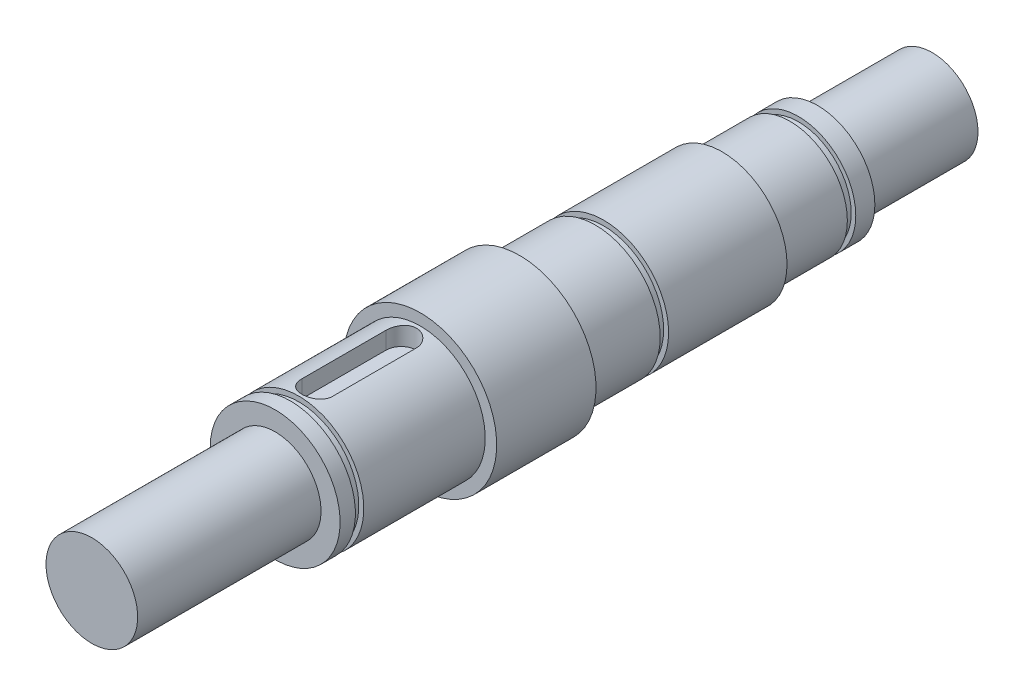
ISO-10303-21;
HEADER;
FILE_DESCRIPTION(('STEP AP214'),'2;1');
FILE_NAME('part.step','',(''),(''),'','','');
FILE_SCHEMA(('AUTOMOTIVE_DESIGN { 1 0 10303 214 1 1 1 1 }'));
ENDSEC;
DATA;
#1=APPLICATION_CONTEXT('core data for automotive mechanical design processes');
#2=APPLICATION_PROTOCOL_DEFINITION('international standard','automotive_design',2000,#1);
#3=PRODUCT_CONTEXT('',#1,'mechanical');
#4=PRODUCT('Part','Part','',(#3));
#5=PRODUCT_RELATED_PRODUCT_CATEGORY('part','',(#4));
#6=PRODUCT_DEFINITION_FORMATION('','',#4);
#7=PRODUCT_DEFINITION_CONTEXT('part definition',#1,'design');
#8=PRODUCT_DEFINITION('design','',#6,#7);
#9=PRODUCT_DEFINITION_SHAPE('','',#8);
#10=(LENGTH_UNIT() NAMED_UNIT(*) SI_UNIT(.MILLI.,.METRE.));
#11=(NAMED_UNIT(*) PLANE_ANGLE_UNIT() SI_UNIT($,.RADIAN.));
#12=(NAMED_UNIT(*) SI_UNIT($,.STERADIAN.) SOLID_ANGLE_UNIT());
#13=UNCERTAINTY_MEASURE_WITH_UNIT(LENGTH_MEASURE(1.E-05),#10,'distance_accuracy_value','');
#14=(GEOMETRIC_REPRESENTATION_CONTEXT(3) GLOBAL_UNCERTAINTY_ASSIGNED_CONTEXT((#13)) GLOBAL_UNIT_ASSIGNED_CONTEXT((#10,
#11,#12)) REPRESENTATION_CONTEXT('',''));
#15=CARTESIAN_POINT('',(0.,0.,0.));
#16=DIRECTION('',(0.,0.,1.));
#17=DIRECTION('',(1.,0.,0.));
#18=AXIS2_PLACEMENT_3D('',#15,#16,#17);
#19=CARTESIAN_POINT('',(0.,0.,0.));
#20=DIRECTION('',(0.,0.,1.));
#21=DIRECTION('',(1.,0.,0.));
#22=AXIS2_PLACEMENT_3D('',#19,#20,#21);
#23=CYLINDRICAL_SURFACE('',#22,8.5);
#24=CARTESIAN_POINT('',(0.,0.,-21.5));
#25=DIRECTION('',(0.,0.,1.));
#26=DIRECTION('',(1.,0.,0.));
#27=AXIS2_PLACEMENT_3D('',#24,#25,#26);
#28=CIRCLE('',#27,8.5);
#29=CARTESIAN_POINT('',(8.5,0.,-21.5));
#30=VERTEX_POINT('',#29);
#31=EDGE_CURVE('E148',#30,#30,#28,.T.);
#32=ORIENTED_EDGE('',*,*,#31,.T.);
#33=EDGE_LOOP('',(#32));
#34=FACE_BOUND('',#33,.T.);
#35=CARTESIAN_POINT('',(0.,0.,-5.99999999999999));
#36=DIRECTION('',(0.,0.,1.));
#37=DIRECTION('',(1.,0.,0.));
#38=AXIS2_PLACEMENT_3D('',#35,#36,#37);
#39=CIRCLE('',#38,8.5);
#40=CARTESIAN_POINT('',(8.5,0.,-5.99999999999999));
#41=VERTEX_POINT('',#40);
#42=EDGE_CURVE('E115',#41,#41,#39,.T.);
#43=ORIENTED_EDGE('',*,*,#42,.F.);
#44=EDGE_LOOP('',(#43));
#45=FACE_BOUND('',#44,.T.);
#46=ADVANCED_FACE('F34',(#34,#45),#23,.T.);
#47=CARTESIAN_POINT('',(0.,0.,0.));
#48=DIRECTION('',(0.,0.,1.));
#49=DIRECTION('',(1.,0.,0.));
#50=AXIS2_PLACEMENT_3D('',#47,#48,#49);
#51=CYLINDRICAL_SURFACE('',#50,7.5);
#52=CARTESIAN_POINT('',(0.,0.,-21.5));
#53=DIRECTION('',(0.,0.,1.));
#54=DIRECTION('',(1.,0.,0.));
#55=AXIS2_PLACEMENT_3D('',#52,#53,#54);
#56=CIRCLE('',#55,7.5);
#57=CARTESIAN_POINT('',(7.5,0.,-21.5));
#58=VERTEX_POINT('',#57);
#59=EDGE_CURVE('E145',#58,#58,#56,.T.);
#60=ORIENTED_EDGE('',*,*,#59,.F.);
#61=EDGE_LOOP('',(#60));
#62=FACE_BOUND('',#61,.T.);
#63=CARTESIAN_POINT('',(0.,0.,-30.4));
#64=DIRECTION('',(0.,0.,1.));
#65=DIRECTION('',(1.,0.,0.));
#66=AXIS2_PLACEMENT_3D('',#63,#64,#65);
#67=CIRCLE('',#66,7.5);
#68=CARTESIAN_POINT('',(7.5,0.,-30.4));
#69=VERTEX_POINT('',#68);
#70=EDGE_CURVE('E136',#69,#69,#67,.T.);
#71=ORIENTED_EDGE('',*,*,#70,.T.);
#72=EDGE_LOOP('',(#71));
#73=FACE_BOUND('',#72,.T.);
#74=ADVANCED_FACE('F256',(#62,#73),#51,.T.);
#75=CARTESIAN_POINT('',(0.,8.5,-21.5));
#76=DIRECTION('',(0.,0.,-1.));
#77=DIRECTION('',(-1.,0.,0.));
#78=AXIS2_PLACEMENT_3D('',#75,#76,#77);
#79=PLANE('',#78);
#80=ORIENTED_EDGE('',*,*,#59,.T.);
#81=EDGE_LOOP('',(#80));
#82=FACE_BOUND('',#81,.T.);
#83=ORIENTED_EDGE('',*,*,#31,.F.);
#84=EDGE_LOOP('',(#83));
#85=FACE_BOUND('',#84,.T.);
#86=ADVANCED_FACE('F247',(#82,#85),#79,.T.);
#87=CARTESIAN_POINT('',(0.,7.5,-30.4));
#88=DIRECTION('',(0.,0.,-1.));
#89=DIRECTION('',(-1.,0.,0.));
#90=AXIS2_PLACEMENT_3D('',#87,#88,#89);
#91=PLANE('',#90);
#92=CARTESIAN_POINT('',(0.,0.,-30.4));
#93=DIRECTION('',(0.,0.,1.));
#94=DIRECTION('',(1.,0.,0.));
#95=AXIS2_PLACEMENT_3D('',#92,#93,#94);
#96=CIRCLE('',#95,6.9);
#97=CARTESIAN_POINT('',(6.9,0.,-30.4));
#98=VERTEX_POINT('',#97);
#99=EDGE_CURVE('E133',#98,#98,#96,.T.);
#100=ORIENTED_EDGE('',*,*,#99,.T.);
#101=EDGE_LOOP('',(#100));
#102=FACE_BOUND('',#101,.T.);
#103=ORIENTED_EDGE('',*,*,#70,.F.);
#104=EDGE_LOOP('',(#103));
#105=FACE_BOUND('',#104,.T.);
#106=ADVANCED_FACE('F243',(#102,#105),#91,.T.);
#107=CARTESIAN_POINT('',(0.,0.,0.));
#108=DIRECTION('',(0.,0.,1.));
#109=DIRECTION('',(1.,0.,0.));
#110=AXIS2_PLACEMENT_3D('',#107,#108,#109);
#111=CYLINDRICAL_SURFACE('',#110,6.9);
#112=CARTESIAN_POINT('',(0.,0.,-31.5));
#113=DIRECTION('',(0.,0.,1.));
#114=DIRECTION('',(1.,0.,0.));
#115=AXIS2_PLACEMENT_3D('',#112,#113,#114);
#116=CIRCLE('',#115,6.9);
#117=CARTESIAN_POINT('',(6.9,0.,-31.5));
#118=VERTEX_POINT('',#117);
#119=EDGE_CURVE('E130',#118,#118,#116,.T.);
#120=ORIENTED_EDGE('',*,*,#119,.T.);
#121=EDGE_LOOP('',(#120));
#122=FACE_BOUND('',#121,.T.);
#123=ORIENTED_EDGE('',*,*,#99,.F.);
#124=EDGE_LOOP('',(#123));
#125=FACE_BOUND('',#124,.T.);
#126=ADVANCED_FACE('F239',(#122,#125),#111,.T.);
#127=CARTESIAN_POINT('',(0.,6.9,-31.5));
#128=DIRECTION('',(0.,0.,1.));
#129=DIRECTION('',(1.,0.,0.));
#130=AXIS2_PLACEMENT_3D('',#127,#128,#129);
#131=PLANE('',#130);
#132=CARTESIAN_POINT('',(0.,0.,-31.5));
#133=DIRECTION('',(0.,0.,1.));
#134=DIRECTION('',(1.,0.,0.));
#135=AXIS2_PLACEMENT_3D('',#132,#133,#134);
#136=CIRCLE('',#135,7.5);
#137=CARTESIAN_POINT('',(7.5,0.,-31.5));
#138=VERTEX_POINT('',#137);
#139=EDGE_CURVE('E127',#138,#138,#136,.T.);
#140=ORIENTED_EDGE('',*,*,#139,.T.);
#141=EDGE_LOOP('',(#140));
#142=FACE_BOUND('',#141,.T.);
#143=ORIENTED_EDGE('',*,*,#119,.F.);
#144=EDGE_LOOP('',(#143));
#145=FACE_BOUND('',#144,.T.);
#146=ADVANCED_FACE('F235',(#142,#145),#131,.T.);
#147=CARTESIAN_POINT('',(0.,0.,0.));
#148=DIRECTION('',(0.,0.,1.));
#149=DIRECTION('',(1.,0.,0.));
#150=AXIS2_PLACEMENT_3D('',#147,#148,#149);
#151=CYLINDRICAL_SURFACE('',#150,6.);
#152=CARTESIAN_POINT('',(0.,0.,-49.));
#153=DIRECTION('',(0.,0.,1.));
#154=DIRECTION('',(1.,0.,0.));
#155=AXIS2_PLACEMENT_3D('',#152,#153,#154);
#156=CIRCLE('',#155,6.);
#157=CARTESIAN_POINT('',(6.,0.,-49.));
#158=VERTEX_POINT('',#157);
#159=EDGE_CURVE('E172',#158,#158,#156,.F.);
#160=ORIENTED_EDGE('',*,*,#159,.F.);
#161=EDGE_LOOP('',(#160));
#162=FACE_BOUND('',#161,.T.);
#163=CARTESIAN_POINT('',(0.,0.,-34.));
#164=DIRECTION('',(0.,0.,1.));
#165=DIRECTION('',(1.,0.,0.));
#166=AXIS2_PLACEMENT_3D('',#163,#164,#165);
#167=CIRCLE('',#166,6.);
#168=CARTESIAN_POINT('',(6.,0.,-34.));
#169=VERTEX_POINT('',#168);
#170=EDGE_CURVE('E139',#169,#169,#167,.T.);
#171=ORIENTED_EDGE('',*,*,#170,.F.);
#172=EDGE_LOOP('',(#171));
#173=FACE_BOUND('',#172,.T.);
#174=ADVANCED_FACE('F238',(#162,#173),#151,.T.);
#175=CARTESIAN_POINT('',(0.,7.5,-34.));
#176=DIRECTION('',(0.,0.,-1.));
#177=DIRECTION('',(-1.,0.,0.));
#178=AXIS2_PLACEMENT_3D('',#175,#176,#177);
#179=PLANE('',#178);
#180=ORIENTED_EDGE('',*,*,#170,.T.);
#181=EDGE_LOOP('',(#180));
#182=FACE_BOUND('',#181,.T.);
#183=CARTESIAN_POINT('',(0.,0.,-34.));
#184=DIRECTION('',(0.,0.,1.));
#185=DIRECTION('',(1.,0.,0.));
#186=AXIS2_PLACEMENT_3D('',#183,#184,#185);
#187=CIRCLE('',#186,7.5);
#188=CARTESIAN_POINT('',(7.5,0.,-34.));
#189=VERTEX_POINT('',#188);
#190=EDGE_CURVE('E142',#189,#189,#187,.T.);
#191=ORIENTED_EDGE('',*,*,#190,.F.);
#192=EDGE_LOOP('',(#191));
#193=FACE_BOUND('',#192,.T.);
#194=ADVANCED_FACE('F251',(#182,#193),#179,.T.);
#195=ORIENTED_EDGE('',*,*,#190,.T.);
#196=EDGE_LOOP('',(#195));
#197=FACE_BOUND('',#196,.T.);
#198=ORIENTED_EDGE('',*,*,#139,.F.);
#199=EDGE_LOOP('',(#198));
#200=FACE_BOUND('',#199,.T.);
#201=ADVANCED_FACE('F233',(#197,#200),#51,.T.);
#202=CARTESIAN_POINT('',(0.,8.5,-4.9));
#203=DIRECTION('',(0.,0.,-1.));
#204=DIRECTION('',(-1.,0.,0.));
#205=AXIS2_PLACEMENT_3D('',#202,#203,#204);
#206=PLANE('',#205);
#207=CARTESIAN_POINT('',(0.,0.,-4.9));
#208=DIRECTION('',(0.,0.,1.));
#209=DIRECTION('',(1.,0.,0.));
#210=AXIS2_PLACEMENT_3D('',#207,#208,#209);
#211=CIRCLE('',#210,7.85);
#212=CARTESIAN_POINT('',(7.85,0.,-4.9));
#213=VERTEX_POINT('',#212);
#214=EDGE_CURVE('E121',#213,#213,#211,.T.);
#215=ORIENTED_EDGE('',*,*,#214,.T.);
#216=EDGE_LOOP('',(#215));
#217=FACE_BOUND('',#216,.T.);
#218=CARTESIAN_POINT('',(0.,0.,-4.9));
#219=DIRECTION('',(0.,0.,1.));
#220=DIRECTION('',(1.,0.,0.));
#221=AXIS2_PLACEMENT_3D('',#218,#219,#220);
#222=CIRCLE('',#221,8.5);
#223=CARTESIAN_POINT('',(8.5,0.,-4.9));
#224=VERTEX_POINT('',#223);
#225=EDGE_CURVE('E124',#224,#224,#222,.T.);
#226=ORIENTED_EDGE('',*,*,#225,.F.);
#227=EDGE_LOOP('',(#226));
#228=FACE_BOUND('',#227,.T.);
#229=ADVANCED_FACE('F229',(#217,#228),#206,.T.);
#230=CARTESIAN_POINT('',(0.,0.,0.));
#231=DIRECTION('',(0.,0.,1.));
#232=DIRECTION('',(1.,0.,0.));
#233=AXIS2_PLACEMENT_3D('',#230,#231,#232);
#234=CYLINDRICAL_SURFACE('',#233,7.85);
#235=CARTESIAN_POINT('',(0.,0.,-5.99999999999999));
#236=DIRECTION('',(0.,0.,1.));
#237=DIRECTION('',(1.,0.,0.));
#238=AXIS2_PLACEMENT_3D('',#235,#236,#237);
#239=CIRCLE('',#238,7.85);
#240=CARTESIAN_POINT('',(7.85,0.,-5.99999999999999));
#241=VERTEX_POINT('',#240);
#242=EDGE_CURVE('E118',#241,#241,#239,.T.);
#243=ORIENTED_EDGE('',*,*,#242,.T.);
#244=EDGE_LOOP('',(#243));
#245=FACE_BOUND('',#244,.T.);
#246=ORIENTED_EDGE('',*,*,#214,.F.);
#247=EDGE_LOOP('',(#246));
#248=FACE_BOUND('',#247,.T.);
#249=ADVANCED_FACE('F225',(#245,#248),#234,.T.);
#250=CARTESIAN_POINT('',(0.,7.85,-5.99999999999999));
#251=DIRECTION('',(0.,0.,1.));
#252=DIRECTION('',(1.,0.,0.));
#253=AXIS2_PLACEMENT_3D('',#250,#251,#252);
#254=PLANE('',#253);
#255=ORIENTED_EDGE('',*,*,#42,.T.);
#256=EDGE_LOOP('',(#255));
#257=FACE_BOUND('',#256,.T.);
#258=ORIENTED_EDGE('',*,*,#242,.F.);
#259=EDGE_LOOP('',(#258));
#260=FACE_BOUND('',#259,.T.);
#261=ADVANCED_FACE('F222',(#257,#260),#254,.T.);
#262=CARTESIAN_POINT('',(0.,0.,0.));
#263=DIRECTION('',(0.,0.,-1.));
#264=DIRECTION('',(-1.,0.,0.));
#265=AXIS2_PLACEMENT_3D('',#262,#263,#264);
#266=CYLINDRICAL_SURFACE('',#265,8.49999999999999);
#267=DIRECTION('',(0.,0.,-1.));
#268=VECTOR('',#267,1.);
#269=CARTESIAN_POINT('',(2.,8.26135582092915,0.));
#270=LINE('',#269,#268);
#271=CARTESIAN_POINT('',(2.,8.26135582092915,20.5));
#272=VERTEX_POINT('',#271);
#273=CARTESIAN_POINT('',(2.,8.26135582092915,31.5));
#274=VERTEX_POINT('',#273);
#275=EDGE_CURVE('E11',#272,#274,#270,.F.);
#276=ORIENTED_EDGE('',*,*,#275,.T.);
#277=CARTESIAN_POINT('',(2.,8.26135582092915,31.5));
#278=CARTESIAN_POINT('',(2.00000055504916,8.26135236320291,31.5554344323461));
#279=CARTESIAN_POINT('',(1.99769380139236,8.2619144856103,31.6108415088054));
#280=CARTESIAN_POINT('',(1.98849731170137,8.264134056541,31.7212434339864));
#281=CARTESIAN_POINT('',(1.98160828133566,8.26579133641031,31.7762383448629));
#282=CARTESIAN_POINT('',(1.95416393612277,8.27234056234883,31.9397976249519));
#283=CARTESIAN_POINT('',(1.92683096321235,8.27881027991498,32.0472414713627));
#284=CARTESIAN_POINT('',(1.85496116677948,8.2952069846652,32.2558503459617));
#285=CARTESIAN_POINT('',(1.81042483664592,8.30513387269751,32.3570155541234));
#286=CARTESIAN_POINT('',(1.70546046419012,8.32732086336626,32.5504829517604));
#287=CARTESIAN_POINT('',(1.6450289846229,8.33958147049888,32.6427832183367));
#288=CARTESIAN_POINT('',(1.50874637759439,8.36531906602218,32.8176445304475));
#289=CARTESIAN_POINT('',(1.43264491321002,8.37881352706603,32.9000078464186));
#290=CARTESIAN_POINT('',(1.26771483694585,8.40534737590744,33.0509339049673));
#291=CARTESIAN_POINT('',(1.17888421755235,8.41838669151992,33.1194944666046));
#292=CARTESIAN_POINT('',(0.989672002747237,8.44273322723499,33.2416609494937));
#293=CARTESIAN_POINT('',(0.889162184224324,8.45401726068055,33.2950732925612));
#294=CARTESIAN_POINT('',(0.68028730939155,8.47338148505522,33.3841696035676));
#295=CARTESIAN_POINT('',(0.571923680419551,8.48146225642123,33.4198567836348));
#296=CARTESIAN_POINT('',(0.352485313548646,8.49338596556868,33.4718616310578));
#297=CARTESIAN_POINT('',(0.241494636223676,8.49730265616028,33.4885167992637));
#298=CARTESIAN_POINT('',(0.0182275662118484,8.50071323920615,33.5030423420087));
#299=CARTESIAN_POINT('',(-0.0940486848647809,8.50020761420043,33.5009147660224));
#300=CARTESIAN_POINT('',(-0.314360678706196,8.49488597842208,33.4781814254168));
#301=CARTESIAN_POINT('',(-0.422436389839878,8.490154991221,33.4579401327781));
#302=CARTESIAN_POINT('',(-0.633611361576776,8.47701221926344,33.4001375163765));
#303=CARTESIAN_POINT('',(-0.736710417304356,8.46860028311536,33.3625754802352));
#304=CARTESIAN_POINT('',(-0.935993037737942,8.44890733460507,33.2708889810726));
#305=CARTESIAN_POINT('',(-1.03211256730711,8.43760323594277,33.2166304990674));
#306=CARTESIAN_POINT('',(-1.21400998738322,8.41335915429893,33.0931932832842));
#307=CARTESIAN_POINT('',(-1.29978653304344,8.40041895903103,33.0240126125025));
#308=CARTESIAN_POINT('',(-1.46072775473717,8.37395331213205,32.870735689924));
#309=CARTESIAN_POINT('',(-1.53558950612902,8.36042126513727,32.7863222321904));
#310=CARTESIAN_POINT('',(-1.67017505039282,8.33458019092887,32.6059723999822));
#311=CARTESIAN_POINT('',(-1.72989470920644,8.32227149826904,32.5100328892058));
#312=CARTESIAN_POINT('',(-1.83266918418549,8.30024752435884,32.3087960773831));
#313=CARTESIAN_POINT('',(-1.87564929064842,8.29054392828406,32.2034593464437));
#314=CARTESIAN_POINT('',(-1.94314531697339,8.27498678101182,31.9868380328643));
#315=CARTESIAN_POINT('',(-1.96768876833644,8.26912749076621,31.8755625857552));
#316=CARTESIAN_POINT('',(-1.9884132926376,8.26415363873448,31.7194550079354));
#317=CARTESIAN_POINT('',(-1.99275932156623,8.26310592036968,31.6756461268753));
#318=CARTESIAN_POINT('',(-1.99854927861068,8.26170741326239,31.5878983269988));
#319=CARTESIAN_POINT('',(-1.9999979705845,8.26135548050656,31.5439597408004));
#320=CARTESIAN_POINT('',(-2.,8.26135582092915,31.5));
#321=B_SPLINE_CURVE_WITH_KNOTS('',3,(#277,#278,#279,#280,#281,#282,#283,#284,#285,#286,#287,
#288,#289,#290,#291,#292,#293,#294,#295,#296,#297,#298,#299,#300,#301,#302,#303,#304,#305,#306,
#307,#308,#309,#310,#311,#312,#313,#314,#315,#316,#317,#318,#319,#320),.UNSPECIFIED.,.F.,.F.,(4,
2,2,2,2,2,2,2,2,2,2,2,2,2,2,2,2,2,2,2,2,4),(0.,0.16619859764888,0.332371606715097,
0.663814743733813,0.995248375734662,1.32675373757506,1.66403554066598,2.00137059509772,
2.34283993997873,2.6842473816804,3.01950170621967,3.35471945001223,3.68334015893414,
4.01197438477704,4.34331851400086,4.67470567990143,5.01401985792581,5.35342657519617,
5.69433118783423,6.03472570922611,6.16675483550179,6.29856669785088),.UNSPECIFIED.);
#322=CARTESIAN_POINT('',(-2.,8.26135582092915,31.5));
#323=VERTEX_POINT('',#322);
#324=EDGE_CURVE('E175',#274,#323,#321,.T.);
#325=ORIENTED_EDGE('',*,*,#324,.T.);
#326=DIRECTION('',(0.,0.,-1.));
#327=VECTOR('',#326,1.);
#328=CARTESIAN_POINT('',(-2.,8.26135582092915,0.));
#329=LINE('',#328,#327);
#330=CARTESIAN_POINT('',(-2.,8.26135582092915,20.5));
#331=VERTEX_POINT('',#330);
#332=EDGE_CURVE('E42',#323,#331,#329,.T.);
#333=ORIENTED_EDGE('',*,*,#332,.T.);
#334=CARTESIAN_POINT('',(-2.,8.26135582092915,20.5));
#335=CARTESIAN_POINT('',(-2.00000055504916,8.26135236320291,20.4445655676539));
#336=CARTESIAN_POINT('',(-1.99769380139236,8.2619144856103,20.3891584911946));
#337=CARTESIAN_POINT('',(-1.98849731170137,8.264134056541,20.2787565660136));
#338=CARTESIAN_POINT('',(-1.98160828133565,8.26579133641031,20.2237616551371));
#339=CARTESIAN_POINT('',(-1.95416393612277,8.27234056234883,20.0602023750481));
#340=CARTESIAN_POINT('',(-1.92683096321234,8.27881027991498,19.9527585286373));
#341=CARTESIAN_POINT('',(-1.85496116677948,8.2952069846652,19.7441496540383));
#342=CARTESIAN_POINT('',(-1.81042483664591,8.30513387269751,19.6429844458766));
#343=CARTESIAN_POINT('',(-1.70546046419011,8.32732086336626,19.4495170482396));
#344=CARTESIAN_POINT('',(-1.6450289846229,8.33958147049888,19.3572167816633));
#345=CARTESIAN_POINT('',(-1.50874637759438,8.36531906602218,19.1823554695525));
#346=CARTESIAN_POINT('',(-1.43264491321001,8.37881352706602,19.0999921535814));
#347=CARTESIAN_POINT('',(-1.26771483694585,8.40534737590744,18.9490660950327));
#348=CARTESIAN_POINT('',(-1.17888421755235,8.41838669151992,18.8805055333954));
#349=CARTESIAN_POINT('',(-0.989672002747237,8.44273322723499,18.7583390505063));
#350=CARTESIAN_POINT('',(-0.889162184224324,8.45401726068055,18.7049267074388));
#351=CARTESIAN_POINT('',(-0.680287309391547,8.47338148505522,18.6158303964324));
#352=CARTESIAN_POINT('',(-0.571923680419547,8.48146225642123,18.5801432163652));
#353=CARTESIAN_POINT('',(-0.352485313548639,8.49338596556868,18.5281383689422));
#354=CARTESIAN_POINT('',(-0.24149463622367,8.49730265616028,18.5114832007363));
#355=CARTESIAN_POINT('',(-0.0182275662118424,8.50071323920615,18.4969576579913));
#356=CARTESIAN_POINT('',(0.0940486848647869,8.50020761420043,18.4990852339776));
#357=CARTESIAN_POINT('',(0.314360678706201,8.49488597842208,18.5218185745832));
#358=CARTESIAN_POINT('',(0.422436389839883,8.490154991221,18.5420598672219));
#359=CARTESIAN_POINT('',(0.63361136157678,8.47701221926344,18.5998624836235));
#360=CARTESIAN_POINT('',(0.73671041730436,8.46860028311536,18.6374245197648));
#361=CARTESIAN_POINT('',(0.935993037737945,8.44890733460507,18.7291110189275));
#362=CARTESIAN_POINT('',(1.03211256730711,8.43760323594277,18.7833695009326));
#363=CARTESIAN_POINT('',(1.21400998738323,8.41335915429893,18.9068067167158));
#364=CARTESIAN_POINT('',(1.29978653304345,8.40041895903103,18.9759873874975));
#365=CARTESIAN_POINT('',(1.46072775473717,8.37395331213205,19.129264310076));
#366=CARTESIAN_POINT('',(1.53558950612902,8.36042126513727,19.2136777678096));
#367=CARTESIAN_POINT('',(1.67017505039283,8.33458019092887,19.3940276000178));
#368=CARTESIAN_POINT('',(1.72989470920645,8.32227149826904,19.4899671107942));
#369=CARTESIAN_POINT('',(1.8326691841855,8.30024752435884,19.6912039226169));
#370=CARTESIAN_POINT('',(1.87564929064842,8.29054392828406,19.7965406535563));
#371=CARTESIAN_POINT('',(1.94314531697339,8.27498678101181,20.0131619671357));
#372=CARTESIAN_POINT('',(1.96768876833644,8.26912749076621,20.1244374142448));
#373=CARTESIAN_POINT('',(1.98841329263761,8.26415363873448,20.2805449920646));
#374=CARTESIAN_POINT('',(1.99275932156623,8.26310592036968,20.3243538731247));
#375=CARTESIAN_POINT('',(1.99854927861069,8.26170741326239,20.4121016730012));
#376=CARTESIAN_POINT('',(1.99999797058451,8.26135548050656,20.4560402591997));
#377=CARTESIAN_POINT('',(2.,8.26135582092915,20.5));
#378=B_SPLINE_CURVE_WITH_KNOTS('',3,(#334,#335,#336,#337,#338,#339,#340,#341,#342,#343,#344,
#345,#346,#347,#348,#349,#350,#351,#352,#353,#354,#355,#356,#357,#358,#359,#360,#361,#362,#363,
#364,#365,#366,#367,#368,#369,#370,#371,#372,#373,#374,#375,#376,#377),.UNSPECIFIED.,.F.,.F.,(4,
2,2,2,2,2,2,2,2,2,2,2,2,2,2,2,2,2,2,2,2,4),(0.,0.166198597648891,0.332371606715107,
0.663814743733813,0.995248375734663,1.32675373757507,1.66403554066599,2.00137059509771,
2.34283993997873,2.6842473816804,3.01950170621968,3.35471945001223,3.68334015893414,
4.01197438477704,4.34331851400086,4.67470567990143,5.01401985792581,5.35342657519617,
5.69433118783423,6.03472570922611,6.16675483550179,6.29856669785088),.UNSPECIFIED.);
#379=EDGE_CURVE('E49',#331,#272,#378,.T.);
#380=ORIENTED_EDGE('',*,*,#379,.T.);
#381=EDGE_LOOP('',(#276,#325,#333,#380));
#382=FACE_BOUND('',#381,.T.);
#383=CARTESIAN_POINT('',(0.,0.,33.9));
#384=DIRECTION('',(0.,0.,-1.));
#385=DIRECTION('',(-1.,0.,0.));
#386=AXIS2_PLACEMENT_3D('',#383,#384,#385);
#387=CIRCLE('',#386,8.49999999999999);
#388=CARTESIAN_POINT('',(-8.49999999999999,0.,33.9));
#389=VERTEX_POINT('',#388);
#390=EDGE_CURVE('E100',#389,#389,#387,.T.);
#391=ORIENTED_EDGE('',*,*,#390,.T.);
#392=EDGE_LOOP('',(#391));
#393=FACE_BOUND('',#392,.T.);
#394=CARTESIAN_POINT('',(0.,0.,18.));
#395=DIRECTION('',(0.,0.,-1.));
#396=DIRECTION('',(-1.,0.,0.));
#397=AXIS2_PLACEMENT_3D('',#394,#395,#396);
#398=CIRCLE('',#397,8.5);
#399=CARTESIAN_POINT('',(-8.5,0.,18.));
#400=VERTEX_POINT('',#399);
#401=EDGE_CURVE('E160',#400,#400,#398,.T.);
#402=ORIENTED_EDGE('',*,*,#401,.F.);
#403=EDGE_LOOP('',(#402));
#404=FACE_BOUND('',#403,.T.);
#405=ADVANCED_FACE('F187',(#382,#393,#404),#266,.T.);
#406=CARTESIAN_POINT('',(0.,10.,18.));
#407=DIRECTION('',(0.,0.,-1.));
#408=DIRECTION('',(-1.,0.,0.));
#409=AXIS2_PLACEMENT_3D('',#406,#407,#408);
#410=PLANE('',#409);
#411=CARTESIAN_POINT('',(0.,0.,18.));
#412=DIRECTION('',(0.,0.,-1.));
#413=DIRECTION('',(-1.,0.,0.));
#414=AXIS2_PLACEMENT_3D('',#411,#412,#413);
#415=CIRCLE('',#414,10.);
#416=CARTESIAN_POINT('',(-10.,0.,18.));
#417=VERTEX_POINT('',#416);
#418=EDGE_CURVE('E163',#417,#417,#415,.T.);
#419=ORIENTED_EDGE('',*,*,#418,.F.);
#420=EDGE_LOOP('',(#419));
#421=FACE_BOUND('',#420,.T.);
#422=ORIENTED_EDGE('',*,*,#401,.T.);
#423=EDGE_LOOP('',(#422));
#424=FACE_BOUND('',#423,.T.);
#425=ADVANCED_FACE('F297',(#421,#424),#410,.F.);
#426=CARTESIAN_POINT('',(0.,0.,61.));
#427=DIRECTION('',(0.,0.,-1.));
#428=DIRECTION('',(-1.,0.,0.));
#429=AXIS2_PLACEMENT_3D('',#426,#427,#428);
#430=CYLINDRICAL_SURFACE('',#429,10.);
#431=CARTESIAN_POINT('',(0.,0.,5.));
#432=DIRECTION('',(0.,0.,1.));
#433=DIRECTION('',(1.,0.,0.));
#434=AXIS2_PLACEMENT_3D('',#431,#432,#433);
#435=CIRCLE('',#434,10.);
#436=CARTESIAN_POINT('',(-10.,0.,5.));
#437=VERTEX_POINT('',#436);
#438=EDGE_CURVE('E169',#437,#437,#435,.T.);
#439=CARTESIAN_POINT('',(-10.,0.,18.));
#440=CARTESIAN_POINT('',(-10.,0.,17.8645833333333));
#441=CARTESIAN_POINT('',(-10.,0.,17.7291666666667));
#442=CARTESIAN_POINT('',(-10.,0.,17.4583333333333));
#443=CARTESIAN_POINT('',(-10.,0.,17.3229166666667));
#444=CARTESIAN_POINT('',(-10.,0.,17.0520833333333));
#445=CARTESIAN_POINT('',(-10.,0.,16.9166666666667));
#446=CARTESIAN_POINT('',(-10.,0.,16.6458333333333));
#447=CARTESIAN_POINT('',(-10.,0.,16.5104166666667));
#448=CARTESIAN_POINT('',(-10.,0.,16.2395833333333));
#449=CARTESIAN_POINT('',(-10.,0.,16.1041666666667));
#450=CARTESIAN_POINT('',(-10.,0.,15.8333333333333));
#451=CARTESIAN_POINT('',(-10.,0.,15.6979166666667));
#452=CARTESIAN_POINT('',(-10.,0.,15.4270833333333));
#453=CARTESIAN_POINT('',(-10.,0.,15.2916666666667));
#454=CARTESIAN_POINT('',(-10.,0.,15.0208333333333));
#455=CARTESIAN_POINT('',(-10.,0.,14.8854166666667));
#456=CARTESIAN_POINT('',(-10.,0.,14.6145833333333));
#457=CARTESIAN_POINT('',(-10.,0.,14.4791666666667));
#458=CARTESIAN_POINT('',(-10.,0.,14.2083333333333));
#459=CARTESIAN_POINT('',(-10.,0.,14.0729166666667));
#460=CARTESIAN_POINT('',(-10.,0.,13.8020833333333));
#461=CARTESIAN_POINT('',(-10.,0.,13.6666666666667));
#462=CARTESIAN_POINT('',(-10.,0.,13.3958333333333));
#463=CARTESIAN_POINT('',(-10.,0.,13.2604166666667));
#464=CARTESIAN_POINT('',(-10.,0.,12.9895833333333));
#465=CARTESIAN_POINT('',(-10.,0.,12.8541666666667));
#466=CARTESIAN_POINT('',(-10.,0.,12.5833333333333));
#467=CARTESIAN_POINT('',(-10.,0.,12.4479166666667));
#468=CARTESIAN_POINT('',(-10.,0.,12.1770833333333));
#469=CARTESIAN_POINT('',(-10.,0.,12.0416666666667));
#470=CARTESIAN_POINT('',(-10.,0.,11.7708333333333));
#471=CARTESIAN_POINT('',(-10.,0.,11.6354166666667));
#472=CARTESIAN_POINT('',(-10.,0.,11.3645833333333));
#473=CARTESIAN_POINT('',(-10.,0.,11.2291666666667));
#474=CARTESIAN_POINT('',(-10.,0.,10.9583333333333));
#475=CARTESIAN_POINT('',(-10.,0.,10.8229166666667));
#476=CARTESIAN_POINT('',(-10.,0.,10.5520833333333));
#477=CARTESIAN_POINT('',(-10.,0.,10.4166666666667));
#478=CARTESIAN_POINT('',(-10.,0.,10.1458333333333));
#479=CARTESIAN_POINT('',(-10.,0.,10.0104166666667));
#480=CARTESIAN_POINT('',(-10.,0.,9.73958333333334));
#481=CARTESIAN_POINT('',(-10.,0.,9.60416666666667));
#482=CARTESIAN_POINT('',(-10.,0.,9.33333333333334));
#483=CARTESIAN_POINT('',(-10.,0.,9.19791666666667));
#484=CARTESIAN_POINT('',(-10.,0.,8.92708333333333));
#485=CARTESIAN_POINT('',(-10.,0.,8.79166666666666));
#486=CARTESIAN_POINT('',(-10.,0.,8.52083333333333));
#487=CARTESIAN_POINT('',(-10.,0.,8.38541666666667));
#488=CARTESIAN_POINT('',(-10.,0.,8.11458333333333));
#489=CARTESIAN_POINT('',(-10.,0.,7.97916666666667));
#490=CARTESIAN_POINT('',(-10.,0.,7.70833333333334));
#491=CARTESIAN_POINT('',(-10.,0.,7.57291666666667));
#492=CARTESIAN_POINT('',(-10.,0.,7.30208333333333));
#493=CARTESIAN_POINT('',(-10.,0.,7.16666666666666));
#494=CARTESIAN_POINT('',(-10.,0.,6.89583333333333));
#495=CARTESIAN_POINT('',(-10.,0.,6.76041666666666));
#496=CARTESIAN_POINT('',(-10.,0.,6.48958333333333));
#497=CARTESIAN_POINT('',(-10.,0.,6.35416666666667));
#498=CARTESIAN_POINT('',(-10.,0.,6.08333333333333));
#499=CARTESIAN_POINT('',(-10.,0.,5.94791666666667));
#500=CARTESIAN_POINT('',(-10.,0.,5.67708333333333));
#501=CARTESIAN_POINT('',(-10.,0.,5.54166666666666));
#502=CARTESIAN_POINT('',(-10.,0.,5.27083333333333));
#503=CARTESIAN_POINT('',(-10.,0.,5.13541666666666));
#504=CARTESIAN_POINT('',(-10.,0.,5.));
#505=B_SPLINE_CURVE_WITH_KNOTS('',3,(#439,#440,#441,#442,#443,#444,#445,#446,#447,#448,#449,
#450,#451,#452,#453,#454,#455,#456,#457,#458,#459,#460,#461,#462,#463,#464,#465,#466,#467,#468,
#469,#470,#471,#472,#473,#474,#475,#476,#477,#478,#479,#480,#481,#482,#483,#484,#485,#486,#487,
#488,#489,#490,#491,#492,#493,#494,#495,#496,#497,#498,#499,#500,#501,#502,#503,#504),
.UNSPECIFIED.,.F.,.F.,(4,2,2,2,2,2,2,2,2,2,2,2,2,2,2,2,2,2,2,2,2,2,2,2,2,2,2,2,2,2,2,2,4),(0.,
0.406249999999997,0.812500000000001,1.21875,1.625,2.03125,2.4375,2.84375000000001,3.25,3.65625,
4.0625,4.46875000000001,4.875,5.28125,5.68750000000001,6.09375000000001,6.50000000000001,
6.90625,7.31250000000001,7.71875000000001,8.12500000000001,8.53125,8.93750000000001,
9.34375000000001,9.75000000000001,10.15625,10.5625,10.96875,11.375,11.78125,12.1875,12.59375,
13.),.UNSPECIFIED.);
#506=EDGE_CURVE('BSEAM36',#417,#437,#505,.T.);
#507=ORIENTED_EDGE('',*,*,#418,.T.);
#508=ORIENTED_EDGE('',*,*,#438,.T.);
#509=ORIENTED_EDGE('',*,*,#506,.T.);
#510=ORIENTED_EDGE('',*,*,#506,.F.);
#511=EDGE_LOOP('',(#507,#509,#508,#510));
#512=FACE_BOUND('',#511,.T.);
#513=ADVANCED_FACE('F36',(#512),#430,.T.);
#514=CARTESIAN_POINT('',(0.,10.,5.));
#515=DIRECTION('',(0.,0.,-1.));
#516=DIRECTION('',(-1.,0.,0.));
#517=AXIS2_PLACEMENT_3D('',#514,#515,#516);
#518=PLANE('',#517);
#519=CARTESIAN_POINT('',(0.,0.,5.));
#520=DIRECTION('',(0.,0.,1.));
#521=DIRECTION('',(1.,0.,0.));
#522=AXIS2_PLACEMENT_3D('',#519,#520,#521);
#523=CIRCLE('',#522,8.5);
#524=CARTESIAN_POINT('',(8.5,0.,5.));
#525=VERTEX_POINT('',#524);
#526=EDGE_CURVE('E166',#525,#525,#523,.T.);
#527=ORIENTED_EDGE('',*,*,#526,.T.);
#528=EDGE_LOOP('',(#527));
#529=FACE_BOUND('',#528,.T.);
#530=ORIENTED_EDGE('',*,*,#438,.F.);
#531=EDGE_LOOP('',(#530));
#532=FACE_BOUND('',#531,.T.);
#533=ADVANCED_FACE('F283',(#529,#532),#518,.T.);
#534=ORIENTED_EDGE('',*,*,#526,.F.);
#535=EDGE_LOOP('',(#534));
#536=FACE_BOUND('',#535,.T.);
#537=ORIENTED_EDGE('',*,*,#225,.T.);
#538=EDGE_LOOP('',(#537));
#539=FACE_BOUND('',#538,.T.);
#540=ADVANCED_FACE('F220',(#536,#539),#23,.T.);
#541=CARTESIAN_POINT('',(0.,8.49999999999999,35.));
#542=DIRECTION('',(0.,0.,1.));
#543=DIRECTION('',(1.,0.,0.));
#544=AXIS2_PLACEMENT_3D('',#541,#542,#543);
#545=PLANE('',#544);
#546=CARTESIAN_POINT('',(0.,0.,35.));
#547=DIRECTION('',(0.,0.,-1.));
#548=DIRECTION('',(-1.,0.,0.));
#549=AXIS2_PLACEMENT_3D('',#546,#547,#548);
#550=CIRCLE('',#549,7.85);
#551=CARTESIAN_POINT('',(-7.85,0.,35.));
#552=VERTEX_POINT('',#551);
#553=EDGE_CURVE('E109',#552,#552,#550,.T.);
#554=ORIENTED_EDGE('',*,*,#553,.F.);
#555=EDGE_LOOP('',(#554));
#556=FACE_BOUND('',#555,.T.);
#557=CARTESIAN_POINT('',(0.,0.,35.));
#558=DIRECTION('',(0.,0.,-1.));
#559=DIRECTION('',(-1.,0.,0.));
#560=AXIS2_PLACEMENT_3D('',#557,#558,#559);
#561=CIRCLE('',#560,8.49999999999999);
#562=CARTESIAN_POINT('',(-8.49999999999999,0.,35.));
#563=VERTEX_POINT('',#562);
#564=EDGE_CURVE('E112',#563,#563,#561,.T.);
#565=ORIENTED_EDGE('',*,*,#564,.T.);
#566=EDGE_LOOP('',(#565));
#567=FACE_BOUND('',#566,.T.);
#568=ADVANCED_FACE('F216',(#556,#567),#545,.F.);
#569=CARTESIAN_POINT('',(0.,0.,0.));
#570=DIRECTION('',(0.,0.,-1.));
#571=DIRECTION('',(-1.,0.,0.));
#572=AXIS2_PLACEMENT_3D('',#569,#570,#571);
#573=CYLINDRICAL_SURFACE('',#572,7.85);
#574=CARTESIAN_POINT('',(0.,0.,33.9));
#575=DIRECTION('',(0.,0.,-1.));
#576=DIRECTION('',(-1.,0.,0.));
#577=AXIS2_PLACEMENT_3D('',#574,#575,#576);
#578=CIRCLE('',#577,7.85);
#579=CARTESIAN_POINT('',(-7.85,0.,33.9));
#580=VERTEX_POINT('',#579);
#581=EDGE_CURVE('E106',#580,#580,#578,.T.);
#582=ORIENTED_EDGE('',*,*,#581,.F.);
#583=EDGE_LOOP('',(#582));
#584=FACE_BOUND('',#583,.T.);
#585=ORIENTED_EDGE('',*,*,#553,.T.);
#586=EDGE_LOOP('',(#585));
#587=FACE_BOUND('',#586,.T.);
#588=ADVANCED_FACE('F212',(#584,#587),#573,.T.);
#589=CARTESIAN_POINT('',(0.,7.85,33.9));
#590=DIRECTION('',(0.,0.,-1.));
#591=DIRECTION('',(-1.,0.,0.));
#592=AXIS2_PLACEMENT_3D('',#589,#590,#591);
#593=PLANE('',#592);
#594=ORIENTED_EDGE('',*,*,#390,.F.);
#595=EDGE_LOOP('',(#594));
#596=FACE_BOUND('',#595,.T.);
#597=ORIENTED_EDGE('',*,*,#581,.T.);
#598=EDGE_LOOP('',(#597));
#599=FACE_BOUND('',#598,.T.);
#600=ADVANCED_FACE('F208',(#596,#599),#593,.F.);
#601=CARTESIAN_POINT('',(0.,0.,61.));
#602=DIRECTION('',(0.,0.,1.));
#603=DIRECTION('',(1.,0.,0.));
#604=AXIS2_PLACEMENT_3D('',#601,#602,#603);
#605=PLANE('',#604);
#606=CARTESIAN_POINT('',(0.,0.,61.));
#607=DIRECTION('',(0.,0.,-1.));
#608=DIRECTION('',(-1.,0.,0.));
#609=AXIS2_PLACEMENT_3D('',#606,#607,#608);
#610=CIRCLE('',#609,5.99999999999999);
#611=CARTESIAN_POINT('',(-5.99999999999999,0.,61.));
#612=VERTEX_POINT('',#611);
#613=EDGE_CURVE('E151',#612,#612,#610,.T.);
#614=ORIENTED_EDGE('',*,*,#613,.F.);
#615=EDGE_LOOP('',(#614));
#616=FACE_BOUND('',#615,.T.);
#617=ADVANCED_FACE('F211',(#616),#605,.T.);
#618=CARTESIAN_POINT('',(0.,0.,0.));
#619=DIRECTION('',(0.,0.,-1.));
#620=DIRECTION('',(-1.,0.,0.));
#621=AXIS2_PLACEMENT_3D('',#618,#619,#620);
#622=CYLINDRICAL_SURFACE('',#621,5.99999999999999);
#623=CARTESIAN_POINT('',(0.,0.,37.));
#624=DIRECTION('',(0.,0.,-1.));
#625=DIRECTION('',(-1.,0.,0.));
#626=AXIS2_PLACEMENT_3D('',#623,#624,#625);
#627=CIRCLE('',#626,6.);
#628=CARTESIAN_POINT('',(-6.,0.,37.));
#629=VERTEX_POINT('',#628);
#630=EDGE_CURVE('E154',#629,#629,#627,.T.);
#631=ORIENTED_EDGE('',*,*,#630,.F.);
#632=EDGE_LOOP('',(#631));
#633=FACE_BOUND('',#632,.T.);
#634=ORIENTED_EDGE('',*,*,#613,.T.);
#635=EDGE_LOOP('',(#634));
#636=FACE_BOUND('',#635,.T.);
#637=ADVANCED_FACE('F263',(#633,#636),#622,.T.);
#638=CARTESIAN_POINT('',(0.,8.49999999999999,37.));
#639=DIRECTION('',(0.,0.,-1.));
#640=DIRECTION('',(-1.,0.,0.));
#641=AXIS2_PLACEMENT_3D('',#638,#639,#640);
#642=PLANE('',#641);
#643=CARTESIAN_POINT('',(0.,0.,37.));
#644=DIRECTION('',(0.,0.,-1.));
#645=DIRECTION('',(-1.,0.,0.));
#646=AXIS2_PLACEMENT_3D('',#643,#644,#645);
#647=CIRCLE('',#646,8.49999999999999);
#648=CARTESIAN_POINT('',(-8.49999999999999,0.,37.));
#649=VERTEX_POINT('',#648);
#650=EDGE_CURVE('E157',#649,#649,#647,.T.);
#651=ORIENTED_EDGE('',*,*,#650,.F.);
#652=EDGE_LOOP('',(#651));
#653=FACE_BOUND('',#652,.T.);
#654=ORIENTED_EDGE('',*,*,#630,.T.);
#655=EDGE_LOOP('',(#654));
#656=FACE_BOUND('',#655,.T.);
#657=ADVANCED_FACE('F265',(#653,#656),#642,.F.);
#658=ORIENTED_EDGE('',*,*,#564,.F.);
#659=EDGE_LOOP('',(#658));
#660=FACE_BOUND('',#659,.T.);
#661=ORIENTED_EDGE('',*,*,#650,.T.);
#662=EDGE_LOOP('',(#661));
#663=FACE_BOUND('',#662,.T.);
#664=ADVANCED_FACE('F206',(#660,#663),#266,.T.);
#665=CARTESIAN_POINT('',(-10.,6.,-49.));
#666=DIRECTION('',(0.,0.,1.));
#667=DIRECTION('',(1.,0.,0.));
#668=AXIS2_PLACEMENT_3D('',#665,#666,#667);
#669=PLANE('',#668);
#670=ORIENTED_EDGE('',*,*,#159,.T.);
#671=EDGE_LOOP('',(#670));
#672=FACE_BOUND('',#671,.T.);
#673=ADVANCED_FACE('F203',(#672),#669,.F.);
#674=CARTESIAN_POINT('',(0.,6.,20.5));
#675=DIRECTION('',(0.,1.,0.));
#676=DIRECTION('',(0.,0.,1.));
#677=AXIS2_PLACEMENT_3D('',#674,#675,#676);
#678=CYLINDRICAL_SURFACE('',#677,2.);
#679=DIRECTION('',(0.,1.,0.));
#680=VECTOR('',#679,1.);
#681=CARTESIAN_POINT('',(-2.,6.,20.5));
#682=LINE('',#681,#680);
#683=CARTESIAN_POINT('',(-2.,6.,20.5));
#684=VERTEX_POINT('',#683);
#685=EDGE_CURVE('E72',#684,#331,#682,.T.);
#686=ORIENTED_EDGE('',*,*,#685,.F.);
#687=CARTESIAN_POINT('',(0.,6.,20.5));
#688=DIRECTION('',(0.,1.,0.));
#689=DIRECTION('',(0.,0.,1.));
#690=AXIS2_PLACEMENT_3D('',#687,#688,#689);
#691=CIRCLE('',#690,2.);
#692=CARTESIAN_POINT('',(2.,6.,20.5));
#693=VERTEX_POINT('',#692);
#694=EDGE_CURVE('E76',#693,#684,#691,.T.);
#695=ORIENTED_EDGE('',*,*,#694,.F.);
#696=DIRECTION('',(0.,1.,0.));
#697=VECTOR('',#696,1.);
#698=CARTESIAN_POINT('',(2.,6.,20.5));
#699=LINE('',#698,#697);
#700=EDGE_CURVE('E98',#693,#272,#699,.T.);
#701=ORIENTED_EDGE('',*,*,#700,.T.);
#702=ORIENTED_EDGE('',*,*,#379,.F.);
#703=EDGE_LOOP('',(#686,#695,#701,#702));
#704=FACE_BOUND('',#703,.T.);
#705=ADVANCED_FACE('F74',(#704),#678,.F.);
#706=CARTESIAN_POINT('',(2.,6.,31.5));
#707=DIRECTION('',(1.,0.,0.));
#708=DIRECTION('',(0.,0.,-1.));
#709=AXIS2_PLACEMENT_3D('',#706,#707,#708);
#710=PLANE('',#709);
#711=ORIENTED_EDGE('',*,*,#700,.F.);
#712=DIRECTION('',(0.,0.,-1.));
#713=VECTOR('',#712,1.);
#714=CARTESIAN_POINT('',(2.,6.,31.5));
#715=LINE('',#714,#713);
#716=CARTESIAN_POINT('',(2.,6.,31.5));
#717=VERTEX_POINT('',#716);
#718=EDGE_CURVE('E81',#717,#693,#715,.T.);
#719=ORIENTED_EDGE('',*,*,#718,.F.);
#720=DIRECTION('',(0.,1.,0.));
#721=VECTOR('',#720,1.);
#722=CARTESIAN_POINT('',(2.,6.,31.5));
#723=LINE('',#722,#721);
#724=EDGE_CURVE('E101',#717,#274,#723,.T.);
#725=ORIENTED_EDGE('',*,*,#724,.T.);
#726=ORIENTED_EDGE('',*,*,#275,.F.);
#727=EDGE_LOOP('',(#711,#719,#725,#726));
#728=FACE_BOUND('',#727,.T.);
#729=ADVANCED_FACE('F196',(#728),#710,.F.);
#730=CARTESIAN_POINT('',(0.,6.,31.5));
#731=DIRECTION('',(0.,1.,0.));
#732=DIRECTION('',(0.,0.,1.));
#733=AXIS2_PLACEMENT_3D('',#730,#731,#732);
#734=CYLINDRICAL_SURFACE('',#733,2.);
#735=ORIENTED_EDGE('',*,*,#724,.F.);
#736=CARTESIAN_POINT('',(0.,6.,31.5));
#737=DIRECTION('',(0.,1.,0.));
#738=DIRECTION('',(0.,0.,-1.));
#739=AXIS2_PLACEMENT_3D('',#736,#737,#738);
#740=CIRCLE('',#739,2.);
#741=CARTESIAN_POINT('',(-2.,6.,31.5));
#742=VERTEX_POINT('',#741);
#743=EDGE_CURVE('E90',#742,#717,#740,.T.);
#744=ORIENTED_EDGE('',*,*,#743,.F.);
#745=DIRECTION('',(0.,1.,0.));
#746=VECTOR('',#745,1.);
#747=CARTESIAN_POINT('',(-2.,6.,31.5));
#748=LINE('',#747,#746);
#749=EDGE_CURVE('E80',#742,#323,#748,.T.);
#750=ORIENTED_EDGE('',*,*,#749,.T.);
#751=ORIENTED_EDGE('',*,*,#324,.F.);
#752=EDGE_LOOP('',(#735,#744,#750,#751));
#753=FACE_BOUND('',#752,.T.);
#754=ADVANCED_FACE('F191',(#753),#734,.F.);
#755=CARTESIAN_POINT('',(-2.,6.,31.5));
#756=DIRECTION('',(-1.,0.,0.));
#757=DIRECTION('',(0.,0.,1.));
#758=AXIS2_PLACEMENT_3D('',#755,#756,#757);
#759=PLANE('',#758);
#760=ORIENTED_EDGE('',*,*,#749,.F.);
#761=DIRECTION('',(0.,0.,1.));
#762=VECTOR('',#761,1.);
#763=CARTESIAN_POINT('',(-2.,6.,31.5));
#764=LINE('',#763,#762);
#765=EDGE_CURVE('E84',#684,#742,#764,.T.);
#766=ORIENTED_EDGE('',*,*,#765,.F.);
#767=ORIENTED_EDGE('',*,*,#685,.T.);
#768=ORIENTED_EDGE('',*,*,#332,.F.);
#769=EDGE_LOOP('',(#760,#766,#767,#768));
#770=FACE_BOUND('',#769,.T.);
#771=ADVANCED_FACE('F85',(#770),#759,.F.);
#772=CARTESIAN_POINT('',(0.,6.,20.5));
#773=DIRECTION('',(0.,1.,0.));
#774=DIRECTION('',(0.,0.,1.));
#775=AXIS2_PLACEMENT_3D('',#772,#773,#774);
#776=PLANE('',#775);
#777=ORIENTED_EDGE('',*,*,#694,.T.);
#778=ORIENTED_EDGE('',*,*,#765,.T.);
#779=ORIENTED_EDGE('',*,*,#743,.T.);
#780=ORIENTED_EDGE('',*,*,#718,.T.);
#781=EDGE_LOOP('',(#777,#778,#779,#780));
#782=FACE_BOUND('',#781,.T.);
#783=ADVANCED_FACE('F92',(#782),#776,.T.);
#784=CLOSED_SHELL('',(#46,#74,#86,#106,#126,#146,#174,#194,#201,#229,#249,#261,#405,#425,#513,
#533,#540,#568,#588,#600,#617,#637,#657,#664,#673,#705,#729,#754,#771,#783));
#785=MANIFOLD_SOLID_BREP('B2',#784);
#786=ADVANCED_BREP_SHAPE_REPRESENTATION('',(#18,#785),#14);
#787=SHAPE_DEFINITION_REPRESENTATION(#9,#786);
ENDSEC;
END-ISO-10303-21;
